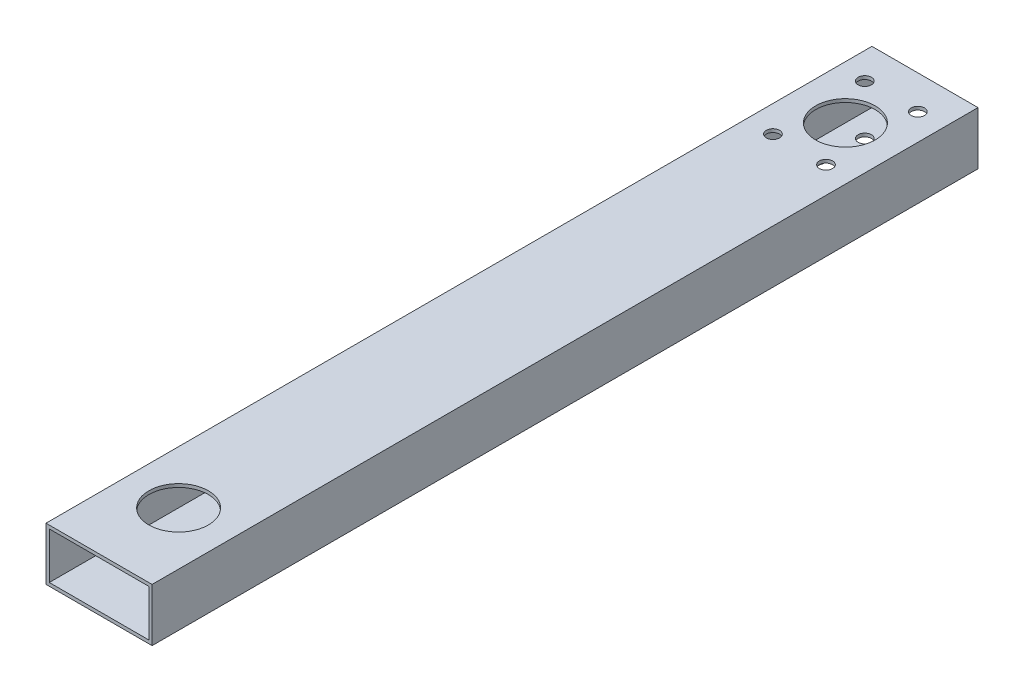
ISO-10303-21;
HEADER;
FILE_DESCRIPTION(('STEP AP214'),'2;1');
FILE_NAME('part.step','',(''),(''),'','','');
FILE_SCHEMA(('AUTOMOTIVE_DESIGN { 1 0 10303 214 1 1 1 1 }'));
ENDSEC;
DATA;
#1=APPLICATION_CONTEXT('core data for automotive mechanical design processes');
#2=APPLICATION_PROTOCOL_DEFINITION('international standard','automotive_design',2000,#1);
#3=PRODUCT_CONTEXT('',#1,'mechanical');
#4=PRODUCT('Part','Part','',(#3));
#5=PRODUCT_RELATED_PRODUCT_CATEGORY('part','',(#4));
#6=PRODUCT_DEFINITION_FORMATION('','',#4);
#7=PRODUCT_DEFINITION_CONTEXT('part definition',#1,'design');
#8=PRODUCT_DEFINITION('design','',#6,#7);
#9=PRODUCT_DEFINITION_SHAPE('','',#8);
#10=(LENGTH_UNIT() NAMED_UNIT(*) SI_UNIT(.MILLI.,.METRE.));
#11=(NAMED_UNIT(*) PLANE_ANGLE_UNIT() SI_UNIT($,.RADIAN.));
#12=(NAMED_UNIT(*) SI_UNIT($,.STERADIAN.) SOLID_ANGLE_UNIT());
#13=UNCERTAINTY_MEASURE_WITH_UNIT(LENGTH_MEASURE(1.E-05),#10,'distance_accuracy_value','');
#14=(GEOMETRIC_REPRESENTATION_CONTEXT(3) GLOBAL_UNCERTAINTY_ASSIGNED_CONTEXT((#13)) GLOBAL_UNIT_ASSIGNED_CONTEXT((#10,
#11,#12)) REPRESENTATION_CONTEXT('',''));
#15=CARTESIAN_POINT('',(0.,0.,0.));
#16=DIRECTION('',(0.,0.,1.));
#17=DIRECTION('',(1.,0.,0.));
#18=AXIS2_PLACEMENT_3D('',#15,#16,#17);
#19=CARTESIAN_POINT('',(0.,0.,395.478));
#20=DIRECTION('',(0.,0.,-1.));
#21=DIRECTION('',(-1.,0.,0.));
#22=AXIS2_PLACEMENT_3D('',#19,#20,#21);
#23=PLANE('',#22);
#24=DIRECTION('',(0.,-1.,0.));
#25=VECTOR('',#24,1.);
#26=CARTESIAN_POINT('',(0.,0.,395.478));
#27=LINE('',#26,#25);
#28=CARTESIAN_POINT('',(0.,25.4,395.478));
#29=VERTEX_POINT('',#28);
#30=CARTESIAN_POINT('',(0.,0.,395.478));
#31=VERTEX_POINT('',#30);
#32=EDGE_CURVE('E163',#29,#31,#27,.T.);
#33=ORIENTED_EDGE('',*,*,#32,.T.);
#34=DIRECTION('',(1.,0.,0.));
#35=VECTOR('',#34,1.);
#36=CARTESIAN_POINT('',(0.,0.,395.478));
#37=LINE('',#36,#35);
#38=CARTESIAN_POINT('',(50.8,0.,395.478));
#39=VERTEX_POINT('',#38);
#40=EDGE_CURVE('E167',#31,#39,#37,.T.);
#41=ORIENTED_EDGE('',*,*,#40,.T.);
#42=DIRECTION('',(0.,1.,0.));
#43=VECTOR('',#42,1.);
#44=CARTESIAN_POINT('',(50.8,0.,395.478));
#45=LINE('',#44,#43);
#46=CARTESIAN_POINT('',(50.8,25.4,395.478));
#47=VERTEX_POINT('',#46);
#48=EDGE_CURVE('E171',#39,#47,#45,.T.);
#49=ORIENTED_EDGE('',*,*,#48,.T.);
#50=DIRECTION('',(-1.,0.,0.));
#51=VECTOR('',#50,1.);
#52=CARTESIAN_POINT('',(0.,25.4,395.478));
#53=LINE('',#52,#51);
#54=EDGE_CURVE('E174',#47,#29,#53,.T.);
#55=ORIENTED_EDGE('',*,*,#54,.T.);
#56=EDGE_LOOP('',(#33,#41,#49,#55));
#57=FACE_BOUND('',#56,.T.);
#58=DIRECTION('',(0.,-1.,0.));
#59=VECTOR('',#58,1.);
#60=CARTESIAN_POINT('',(1.5875,1.5875,395.478));
#61=LINE('',#60,#59);
#62=CARTESIAN_POINT('',(1.5875,23.8125,395.478));
#63=VERTEX_POINT('',#62);
#64=CARTESIAN_POINT('',(1.5875,1.5875,395.478));
#65=VERTEX_POINT('',#64);
#66=EDGE_CURVE('E113',#63,#65,#61,.T.);
#67=ORIENTED_EDGE('',*,*,#66,.F.);
#68=DIRECTION('',(-1.,0.,0.));
#69=VECTOR('',#68,1.);
#70=CARTESIAN_POINT('',(1.5875,23.8125,395.478));
#71=LINE('',#70,#69);
#72=CARTESIAN_POINT('',(49.2125,23.8125,395.478));
#73=VERTEX_POINT('',#72);
#74=EDGE_CURVE('E139',#73,#63,#71,.T.);
#75=ORIENTED_EDGE('',*,*,#74,.F.);
#76=DIRECTION('',(0.,1.,0.));
#77=VECTOR('',#76,1.);
#78=CARTESIAN_POINT('',(49.2125,1.5875,395.478));
#79=LINE('',#78,#77);
#80=CARTESIAN_POINT('',(49.2125,1.5875,395.478));
#81=VERTEX_POINT('',#80);
#82=EDGE_CURVE('E135',#81,#73,#79,.T.);
#83=ORIENTED_EDGE('',*,*,#82,.F.);
#84=DIRECTION('',(1.,0.,0.));
#85=VECTOR('',#84,1.);
#86=CARTESIAN_POINT('',(1.5875,1.5875,395.478));
#87=LINE('',#86,#85);
#88=EDGE_CURVE('E122',#65,#81,#87,.T.);
#89=ORIENTED_EDGE('',*,*,#88,.F.);
#90=EDGE_LOOP('',(#67,#75,#83,#89));
#91=FACE_BOUND('',#90,.T.);
#92=ADVANCED_FACE('F45',(#57,#91),#23,.F.);
#93=CARTESIAN_POINT('',(0.,0.,0.));
#94=DIRECTION('',(0.,0.,-1.));
#95=DIRECTION('',(-1.,0.,0.));
#96=AXIS2_PLACEMENT_3D('',#93,#94,#95);
#97=PLANE('',#96);
#98=DIRECTION('',(0.,-1.,0.));
#99=VECTOR('',#98,1.);
#100=CARTESIAN_POINT('',(0.,0.,0.));
#101=LINE('',#100,#99);
#102=CARTESIAN_POINT('',(0.,25.4,0.));
#103=VERTEX_POINT('',#102);
#104=CARTESIAN_POINT('',(0.,0.,0.));
#105=VERTEX_POINT('',#104);
#106=EDGE_CURVE('E131',#103,#105,#101,.T.);
#107=ORIENTED_EDGE('',*,*,#106,.F.);
#108=DIRECTION('',(-1.,0.,0.));
#109=VECTOR('',#108,1.);
#110=CARTESIAN_POINT('',(0.,25.4,0.));
#111=LINE('',#110,#109);
#112=CARTESIAN_POINT('',(50.8,25.4,0.));
#113=VERTEX_POINT('',#112);
#114=EDGE_CURVE('E168',#113,#103,#111,.T.);
#115=ORIENTED_EDGE('',*,*,#114,.F.);
#116=DIRECTION('',(0.,1.,0.));
#117=VECTOR('',#116,1.);
#118=CARTESIAN_POINT('',(50.8,0.,0.));
#119=LINE('',#118,#117);
#120=CARTESIAN_POINT('',(50.8,0.,0.));
#121=VERTEX_POINT('',#120);
#122=EDGE_CURVE('E184',#121,#113,#119,.T.);
#123=ORIENTED_EDGE('',*,*,#122,.F.);
#124=DIRECTION('',(1.,0.,0.));
#125=VECTOR('',#124,1.);
#126=CARTESIAN_POINT('',(0.,0.,0.));
#127=LINE('',#126,#125);
#128=EDGE_CURVE('E181',#105,#121,#127,.T.);
#129=ORIENTED_EDGE('',*,*,#128,.F.);
#130=EDGE_LOOP('',(#107,#115,#123,#129));
#131=FACE_BOUND('',#130,.T.);
#132=DIRECTION('',(-1.,0.,0.));
#133=VECTOR('',#132,1.);
#134=CARTESIAN_POINT('',(1.5875,23.8125,0.));
#135=LINE('',#134,#133);
#136=CARTESIAN_POINT('',(49.2125,23.8125,0.));
#137=VERTEX_POINT('',#136);
#138=CARTESIAN_POINT('',(1.5875,23.8125,0.));
#139=VERTEX_POINT('',#138);
#140=EDGE_CURVE('E123',#137,#139,#135,.T.);
#141=ORIENTED_EDGE('',*,*,#140,.T.);
#142=DIRECTION('',(0.,-1.,0.));
#143=VECTOR('',#142,1.);
#144=CARTESIAN_POINT('',(1.5875,1.5875,0.));
#145=LINE('',#144,#143);
#146=CARTESIAN_POINT('',(1.5875,1.5875,0.));
#147=VERTEX_POINT('',#146);
#148=EDGE_CURVE('E71',#139,#147,#145,.T.);
#149=ORIENTED_EDGE('',*,*,#148,.T.);
#150=DIRECTION('',(1.,0.,0.));
#151=VECTOR('',#150,1.);
#152=CARTESIAN_POINT('',(1.5875,1.5875,0.));
#153=LINE('',#152,#151);
#154=CARTESIAN_POINT('',(49.2125,1.5875,0.));
#155=VERTEX_POINT('',#154);
#156=EDGE_CURVE('E129',#147,#155,#153,.T.);
#157=ORIENTED_EDGE('',*,*,#156,.T.);
#158=DIRECTION('',(0.,1.,0.));
#159=VECTOR('',#158,1.);
#160=CARTESIAN_POINT('',(49.2125,1.5875,0.));
#161=LINE('',#160,#159);
#162=EDGE_CURVE('E150',#155,#137,#161,.T.);
#163=ORIENTED_EDGE('',*,*,#162,.T.);
#164=EDGE_LOOP('',(#141,#149,#157,#163));
#165=FACE_BOUND('',#164,.T.);
#166=ADVANCED_FACE('F278',(#131,#165),#97,.T.);
#167=CARTESIAN_POINT('',(0.,0.,395.478));
#168=DIRECTION('',(1.,0.,0.));
#169=DIRECTION('',(0.,0.,-1.));
#170=AXIS2_PLACEMENT_3D('',#167,#168,#169);
#171=PLANE('',#170);
#172=ORIENTED_EDGE('',*,*,#106,.T.);
#173=DIRECTION('',(0.,0.,-1.));
#174=VECTOR('',#173,1.);
#175=CARTESIAN_POINT('',(0.,0.,395.478));
#176=LINE('',#175,#174);
#177=EDGE_CURVE('E11',#31,#105,#176,.T.);
#178=ORIENTED_EDGE('',*,*,#177,.F.);
#179=ORIENTED_EDGE('',*,*,#32,.F.);
#180=DIRECTION('',(0.,0.,-1.));
#181=VECTOR('',#180,1.);
#182=CARTESIAN_POINT('',(0.,25.4,395.478));
#183=LINE('',#182,#181);
#184=EDGE_CURVE('E177',#29,#103,#183,.T.);
#185=ORIENTED_EDGE('',*,*,#184,.T.);
#186=EDGE_LOOP('',(#172,#178,#179,#185));
#187=FACE_BOUND('',#186,.T.);
#188=ADVANCED_FACE('F47',(#187),#171,.F.);
#189=CARTESIAN_POINT('',(0.,0.,395.478));
#190=DIRECTION('',(0.,1.,0.));
#191=DIRECTION('',(0.,0.,1.));
#192=AXIS2_PLACEMENT_3D('',#189,#190,#191);
#193=PLANE('',#192);
#194=CARTESIAN_POINT('',(25.4,0.,357.378));
#195=DIRECTION('',(0.,1.,0.));
#196=DIRECTION('',(0.,0.,1.));
#197=AXIS2_PLACEMENT_3D('',#194,#195,#196);
#198=CIRCLE('',#197,14.224);
#199=CARTESIAN_POINT('',(25.4,0.,371.602));
#200=VERTEX_POINT('',#199);
#201=EDGE_CURVE('E305',#200,#200,#198,.T.);
#202=ORIENTED_EDGE('',*,*,#201,.T.);
#203=EDGE_LOOP('',(#202));
#204=FACE_BOUND('',#203,.T.);
#205=CARTESIAN_POINT('',(38.1,0.,16.1029547438753));
#206=DIRECTION('',(0.,1.,0.));
#207=DIRECTION('',(0.,0.,-1.));
#208=AXIS2_PLACEMENT_3D('',#205,#206,#207);
#209=CIRCLE('',#208,3.175);
#210=CARTESIAN_POINT('',(38.1,0.,12.9279547438753));
#211=VERTEX_POINT('',#210);
#212=EDGE_CURVE('E309',#211,#211,#209,.T.);
#213=ORIENTED_EDGE('',*,*,#212,.T.);
#214=EDGE_LOOP('',(#213));
#215=FACE_BOUND('',#214,.T.);
#216=CARTESIAN_POINT('',(38.1,0.,60.0970452561248));
#217=DIRECTION('',(0.,1.,0.));
#218=DIRECTION('',(0.,0.,-1.));
#219=AXIS2_PLACEMENT_3D('',#216,#217,#218);
#220=CIRCLE('',#219,3.175);
#221=CARTESIAN_POINT('',(38.1,0.,56.9220452561248));
#222=VERTEX_POINT('',#221);
#223=EDGE_CURVE('E313',#222,#222,#220,.T.);
#224=ORIENTED_EDGE('',*,*,#223,.T.);
#225=EDGE_LOOP('',(#224));
#226=FACE_BOUND('',#225,.T.);
#227=CARTESIAN_POINT('',(12.7,0.,60.0970452561248));
#228=DIRECTION('',(0.,1.,0.));
#229=DIRECTION('',(0.,0.,1.));
#230=AXIS2_PLACEMENT_3D('',#227,#228,#229);
#231=CIRCLE('',#230,3.175);
#232=CARTESIAN_POINT('',(12.7,0.,63.2720452561247));
#233=VERTEX_POINT('',#232);
#234=EDGE_CURVE('E317',#233,#233,#231,.T.);
#235=ORIENTED_EDGE('',*,*,#234,.T.);
#236=EDGE_LOOP('',(#235));
#237=FACE_BOUND('',#236,.T.);
#238=CARTESIAN_POINT('',(12.7,0.,16.1029547438753));
#239=DIRECTION('',(0.,1.,0.));
#240=DIRECTION('',(0.,0.,1.));
#241=AXIS2_PLACEMENT_3D('',#238,#239,#240);
#242=CIRCLE('',#241,3.175);
#243=CARTESIAN_POINT('',(12.7,0.,19.2779547438753));
#244=VERTEX_POINT('',#243);
#245=EDGE_CURVE('E321',#244,#244,#242,.T.);
#246=ORIENTED_EDGE('',*,*,#245,.T.);
#247=EDGE_LOOP('',(#246));
#248=FACE_BOUND('',#247,.T.);
#249=CARTESIAN_POINT('',(25.4,0.,38.1));
#250=DIRECTION('',(0.,1.,0.));
#251=DIRECTION('',(0.,0.,1.));
#252=AXIS2_PLACEMENT_3D('',#249,#250,#251);
#253=CIRCLE('',#252,14.224);
#254=CARTESIAN_POINT('',(25.4,0.,52.324));
#255=VERTEX_POINT('',#254);
#256=EDGE_CURVE('E204',#255,#255,#253,.T.);
#257=ORIENTED_EDGE('',*,*,#256,.T.);
#258=EDGE_LOOP('',(#257));
#259=FACE_BOUND('',#258,.T.);
#260=ORIENTED_EDGE('',*,*,#128,.T.);
#261=DIRECTION('',(0.,0.,-1.));
#262=VECTOR('',#261,1.);
#263=CARTESIAN_POINT('',(50.8,0.,395.478));
#264=LINE('',#263,#262);
#265=EDGE_CURVE('E55',#39,#121,#264,.T.);
#266=ORIENTED_EDGE('',*,*,#265,.F.);
#267=ORIENTED_EDGE('',*,*,#40,.F.);
#268=ORIENTED_EDGE('',*,*,#177,.T.);
#269=EDGE_LOOP('',(#260,#266,#267,#268));
#270=FACE_BOUND('',#269,.T.);
#271=ADVANCED_FACE('F293',(#204,#215,#226,#237,#248,#259,#270),#193,.F.);
#272=CARTESIAN_POINT('',(50.8,0.,395.478));
#273=DIRECTION('',(-1.,0.,0.));
#274=DIRECTION('',(0.,0.,1.));
#275=AXIS2_PLACEMENT_3D('',#272,#273,#274);
#276=PLANE('',#275);
#277=ORIENTED_EDGE('',*,*,#122,.T.);
#278=DIRECTION('',(0.,0.,-1.));
#279=VECTOR('',#278,1.);
#280=CARTESIAN_POINT('',(50.8,25.4,395.478));
#281=LINE('',#280,#279);
#282=EDGE_CURVE('E192',#47,#113,#281,.T.);
#283=ORIENTED_EDGE('',*,*,#282,.F.);
#284=ORIENTED_EDGE('',*,*,#48,.F.);
#285=ORIENTED_EDGE('',*,*,#265,.T.);
#286=EDGE_LOOP('',(#277,#283,#284,#285));
#287=FACE_BOUND('',#286,.T.);
#288=ADVANCED_FACE('F291',(#287),#276,.F.);
#289=CARTESIAN_POINT('',(0.,25.4,395.478));
#290=DIRECTION('',(0.,-1.,0.));
#291=DIRECTION('',(0.,0.,-1.));
#292=AXIS2_PLACEMENT_3D('',#289,#290,#291);
#293=PLANE('',#292);
#294=CARTESIAN_POINT('',(25.4,25.4,357.378));
#295=DIRECTION('',(0.,-1.,0.));
#296=DIRECTION('',(0.,0.,-1.));
#297=AXIS2_PLACEMENT_3D('',#294,#295,#296);
#298=CIRCLE('',#297,14.224);
#299=CARTESIAN_POINT('',(25.4,25.4,343.154));
#300=VERTEX_POINT('',#299);
#301=EDGE_CURVE('E147',#300,#300,#298,.T.);
#302=ORIENTED_EDGE('',*,*,#301,.T.);
#303=EDGE_LOOP('',(#302));
#304=FACE_BOUND('',#303,.T.);
#305=CARTESIAN_POINT('',(38.1,25.4,16.1029547438753));
#306=DIRECTION('',(0.,-1.,0.));
#307=DIRECTION('',(0.,0.,-1.));
#308=AXIS2_PLACEMENT_3D('',#305,#306,#307);
#309=CIRCLE('',#308,3.175);
#310=CARTESIAN_POINT('',(38.1,25.4,12.9279547438753));
#311=VERTEX_POINT('',#310);
#312=EDGE_CURVE('E232',#311,#311,#309,.T.);
#313=ORIENTED_EDGE('',*,*,#312,.T.);
#314=EDGE_LOOP('',(#313));
#315=FACE_BOUND('',#314,.T.);
#316=CARTESIAN_POINT('',(38.1,25.4,60.0970452561248));
#317=DIRECTION('',(0.,-1.,0.));
#318=DIRECTION('',(0.,0.,-1.));
#319=AXIS2_PLACEMENT_3D('',#316,#317,#318);
#320=CIRCLE('',#319,3.175);
#321=CARTESIAN_POINT('',(38.1,25.4,56.9220452561248));
#322=VERTEX_POINT('',#321);
#323=EDGE_CURVE('E226',#322,#322,#320,.T.);
#324=ORIENTED_EDGE('',*,*,#323,.T.);
#325=EDGE_LOOP('',(#324));
#326=FACE_BOUND('',#325,.T.);
#327=CARTESIAN_POINT('',(12.7,25.4,60.0970452561248));
#328=DIRECTION('',(0.,-1.,0.));
#329=DIRECTION('',(0.,0.,-1.));
#330=AXIS2_PLACEMENT_3D('',#327,#328,#329);
#331=CIRCLE('',#330,3.175);
#332=CARTESIAN_POINT('',(12.7,25.4,56.9220452561248));
#333=VERTEX_POINT('',#332);
#334=EDGE_CURVE('E221',#333,#333,#331,.T.);
#335=ORIENTED_EDGE('',*,*,#334,.T.);
#336=EDGE_LOOP('',(#335));
#337=FACE_BOUND('',#336,.T.);
#338=CARTESIAN_POINT('',(12.7,25.4,16.1029547438753));
#339=DIRECTION('',(0.,-1.,0.));
#340=DIRECTION('',(0.,0.,-1.));
#341=AXIS2_PLACEMENT_3D('',#338,#339,#340);
#342=CIRCLE('',#341,3.175);
#343=CARTESIAN_POINT('',(12.7,25.4,12.9279547438753));
#344=VERTEX_POINT('',#343);
#345=EDGE_CURVE('E216',#344,#344,#342,.T.);
#346=ORIENTED_EDGE('',*,*,#345,.T.);
#347=EDGE_LOOP('',(#346));
#348=FACE_BOUND('',#347,.T.);
#349=CARTESIAN_POINT('',(25.4,25.4,38.1));
#350=DIRECTION('',(0.,-1.,0.));
#351=DIRECTION('',(0.,0.,-1.));
#352=AXIS2_PLACEMENT_3D('',#349,#350,#351);
#353=CIRCLE('',#352,14.224);
#354=CARTESIAN_POINT('',(25.4,25.4,23.876));
#355=VERTEX_POINT('',#354);
#356=EDGE_CURVE('E210',#355,#355,#353,.T.);
#357=ORIENTED_EDGE('',*,*,#356,.T.);
#358=EDGE_LOOP('',(#357));
#359=FACE_BOUND('',#358,.T.);
#360=ORIENTED_EDGE('',*,*,#114,.T.);
#361=ORIENTED_EDGE('',*,*,#184,.F.);
#362=ORIENTED_EDGE('',*,*,#54,.F.);
#363=ORIENTED_EDGE('',*,*,#282,.T.);
#364=EDGE_LOOP('',(#360,#361,#362,#363));
#365=FACE_BOUND('',#364,.T.);
#366=ADVANCED_FACE('F253',(#304,#315,#326,#337,#348,#359,#365),#293,.F.);
#367=CARTESIAN_POINT('',(1.5875,1.5875,395.478));
#368=DIRECTION('',(1.,0.,0.));
#369=DIRECTION('',(0.,0.,-1.));
#370=AXIS2_PLACEMENT_3D('',#367,#368,#369);
#371=PLANE('',#370);
#372=ORIENTED_EDGE('',*,*,#148,.F.);
#373=DIRECTION('',(0.,0.,-1.));
#374=VECTOR('',#373,1.);
#375=CARTESIAN_POINT('',(1.5875,23.8125,395.478));
#376=LINE('',#375,#374);
#377=EDGE_CURVE('E117',#63,#139,#376,.T.);
#378=ORIENTED_EDGE('',*,*,#377,.F.);
#379=ORIENTED_EDGE('',*,*,#66,.T.);
#380=DIRECTION('',(0.,0.,-1.));
#381=VECTOR('',#380,1.);
#382=CARTESIAN_POINT('',(1.5875,1.5875,395.478));
#383=LINE('',#382,#381);
#384=EDGE_CURVE('E116',#65,#147,#383,.T.);
#385=ORIENTED_EDGE('',*,*,#384,.T.);
#386=EDGE_LOOP('',(#372,#378,#379,#385));
#387=FACE_BOUND('',#386,.T.);
#388=ADVANCED_FACE('F115',(#387),#371,.T.);
#389=CARTESIAN_POINT('',(1.5875,1.5875,395.478));
#390=DIRECTION('',(0.,1.,0.));
#391=DIRECTION('',(0.,0.,1.));
#392=AXIS2_PLACEMENT_3D('',#389,#390,#391);
#393=PLANE('',#392);
#394=CARTESIAN_POINT('',(25.4,1.5875,357.378));
#395=DIRECTION('',(0.,1.,0.));
#396=DIRECTION('',(0.,0.,1.));
#397=AXIS2_PLACEMENT_3D('',#394,#395,#396);
#398=CIRCLE('',#397,14.224);
#399=CARTESIAN_POINT('',(25.4,1.5875,371.602));
#400=VERTEX_POINT('',#399);
#401=EDGE_CURVE('E246',#400,#400,#398,.T.);
#402=ORIENTED_EDGE('',*,*,#401,.F.);
#403=EDGE_LOOP('',(#402));
#404=FACE_BOUND('',#403,.T.);
#405=CARTESIAN_POINT('',(38.1,1.5875,16.1029547438753));
#406=DIRECTION('',(0.,1.,0.));
#407=DIRECTION('',(0.,0.,1.));
#408=AXIS2_PLACEMENT_3D('',#405,#406,#407);
#409=CIRCLE('',#408,3.175);
#410=CARTESIAN_POINT('',(38.1,1.5875,19.2779547438753));
#411=VERTEX_POINT('',#410);
#412=EDGE_CURVE('E225',#411,#411,#409,.T.);
#413=ORIENTED_EDGE('',*,*,#412,.F.);
#414=EDGE_LOOP('',(#413));
#415=FACE_BOUND('',#414,.T.);
#416=CARTESIAN_POINT('',(38.1,1.5875,60.0970452561248));
#417=DIRECTION('',(0.,1.,0.));
#418=DIRECTION('',(0.,0.,1.));
#419=AXIS2_PLACEMENT_3D('',#416,#417,#418);
#420=CIRCLE('',#419,3.175);
#421=CARTESIAN_POINT('',(38.1,1.5875,63.2720452561247));
#422=VERTEX_POINT('',#421);
#423=EDGE_CURVE('E220',#422,#422,#420,.T.);
#424=ORIENTED_EDGE('',*,*,#423,.F.);
#425=EDGE_LOOP('',(#424));
#426=FACE_BOUND('',#425,.T.);
#427=CARTESIAN_POINT('',(12.7,1.5875,60.0970452561248));
#428=DIRECTION('',(0.,1.,0.));
#429=DIRECTION('',(0.,0.,1.));
#430=AXIS2_PLACEMENT_3D('',#427,#428,#429);
#431=CIRCLE('',#430,3.175);
#432=CARTESIAN_POINT('',(12.7,1.5875,63.2720452561247));
#433=VERTEX_POINT('',#432);
#434=EDGE_CURVE('E215',#433,#433,#431,.T.);
#435=ORIENTED_EDGE('',*,*,#434,.F.);
#436=EDGE_LOOP('',(#435));
#437=FACE_BOUND('',#436,.T.);
#438=CARTESIAN_POINT('',(12.7,1.5875,16.1029547438753));
#439=DIRECTION('',(0.,1.,0.));
#440=DIRECTION('',(0.,0.,1.));
#441=AXIS2_PLACEMENT_3D('',#438,#439,#440);
#442=CIRCLE('',#441,3.175);
#443=CARTESIAN_POINT('',(12.7,1.5875,19.2779547438753));
#444=VERTEX_POINT('',#443);
#445=EDGE_CURVE('E209',#444,#444,#442,.T.);
#446=ORIENTED_EDGE('',*,*,#445,.F.);
#447=EDGE_LOOP('',(#446));
#448=FACE_BOUND('',#447,.T.);
#449=CARTESIAN_POINT('',(25.4,1.5875,38.1));
#450=DIRECTION('',(0.,1.,0.));
#451=DIRECTION('',(0.,0.,1.));
#452=AXIS2_PLACEMENT_3D('',#449,#450,#451);
#453=CIRCLE('',#452,14.224);
#454=CARTESIAN_POINT('',(25.4,1.5875,52.324));
#455=VERTEX_POINT('',#454);
#456=EDGE_CURVE('E203',#455,#455,#453,.T.);
#457=ORIENTED_EDGE('',*,*,#456,.F.);
#458=EDGE_LOOP('',(#457));
#459=FACE_BOUND('',#458,.T.);
#460=ORIENTED_EDGE('',*,*,#156,.F.);
#461=ORIENTED_EDGE('',*,*,#384,.F.);
#462=ORIENTED_EDGE('',*,*,#88,.T.);
#463=DIRECTION('',(0.,0.,-1.));
#464=VECTOR('',#463,1.);
#465=CARTESIAN_POINT('',(49.2125,1.5875,395.478));
#466=LINE('',#465,#464);
#467=EDGE_CURVE('E132',#81,#155,#466,.T.);
#468=ORIENTED_EDGE('',*,*,#467,.T.);
#469=EDGE_LOOP('',(#460,#461,#462,#468));
#470=FACE_BOUND('',#469,.T.);
#471=ADVANCED_FACE('F126',(#404,#415,#426,#437,#448,#459,#470),#393,.T.);
#472=CARTESIAN_POINT('',(49.2125,1.5875,395.478));
#473=DIRECTION('',(-1.,0.,0.));
#474=DIRECTION('',(0.,0.,1.));
#475=AXIS2_PLACEMENT_3D('',#472,#473,#474);
#476=PLANE('',#475);
#477=ORIENTED_EDGE('',*,*,#162,.F.);
#478=ORIENTED_EDGE('',*,*,#467,.F.);
#479=ORIENTED_EDGE('',*,*,#82,.T.);
#480=DIRECTION('',(0.,0.,-1.));
#481=VECTOR('',#480,1.);
#482=CARTESIAN_POINT('',(49.2125,23.8125,395.478));
#483=LINE('',#482,#481);
#484=EDGE_CURVE('E63',#73,#137,#483,.T.);
#485=ORIENTED_EDGE('',*,*,#484,.T.);
#486=EDGE_LOOP('',(#477,#478,#479,#485));
#487=FACE_BOUND('',#486,.T.);
#488=ADVANCED_FACE('F340',(#487),#476,.T.);
#489=CARTESIAN_POINT('',(1.5875,23.8125,395.478));
#490=DIRECTION('',(0.,-1.,0.));
#491=DIRECTION('',(0.,0.,-1.));
#492=AXIS2_PLACEMENT_3D('',#489,#490,#491);
#493=PLANE('',#492);
#494=CARTESIAN_POINT('',(25.4,23.8125,357.378));
#495=DIRECTION('',(0.,-1.,0.));
#496=DIRECTION('',(0.,0.,-1.));
#497=AXIS2_PLACEMENT_3D('',#494,#495,#496);
#498=CIRCLE('',#497,14.224);
#499=CARTESIAN_POINT('',(25.4,23.8125,343.154));
#500=VERTEX_POINT('',#499);
#501=EDGE_CURVE('E49',#500,#500,#498,.T.);
#502=ORIENTED_EDGE('',*,*,#501,.F.);
#503=EDGE_LOOP('',(#502));
#504=FACE_BOUND('',#503,.T.);
#505=CARTESIAN_POINT('',(38.1,23.8125,16.1029547438753));
#506=DIRECTION('',(0.,-1.,0.));
#507=DIRECTION('',(0.,0.,-1.));
#508=AXIS2_PLACEMENT_3D('',#505,#506,#507);
#509=CIRCLE('',#508,3.175);
#510=CARTESIAN_POINT('',(38.1,23.8125,12.9279547438753));
#511=VERTEX_POINT('',#510);
#512=EDGE_CURVE('E222',#511,#511,#509,.T.);
#513=ORIENTED_EDGE('',*,*,#512,.F.);
#514=EDGE_LOOP('',(#513));
#515=FACE_BOUND('',#514,.T.);
#516=CARTESIAN_POINT('',(38.1,23.8125,60.0970452561248));
#517=DIRECTION('',(0.,-1.,0.));
#518=DIRECTION('',(0.,0.,-1.));
#519=AXIS2_PLACEMENT_3D('',#516,#517,#518);
#520=CIRCLE('',#519,3.175);
#521=CARTESIAN_POINT('',(38.1,23.8125,56.9220452561248));
#522=VERTEX_POINT('',#521);
#523=EDGE_CURVE('E217',#522,#522,#520,.T.);
#524=ORIENTED_EDGE('',*,*,#523,.F.);
#525=EDGE_LOOP('',(#524));
#526=FACE_BOUND('',#525,.T.);
#527=CARTESIAN_POINT('',(12.7,23.8125,60.0970452561248));
#528=DIRECTION('',(0.,-1.,0.));
#529=DIRECTION('',(0.,0.,-1.));
#530=AXIS2_PLACEMENT_3D('',#527,#528,#529);
#531=CIRCLE('',#530,3.175);
#532=CARTESIAN_POINT('',(12.7,23.8125,56.9220452561248));
#533=VERTEX_POINT('',#532);
#534=EDGE_CURVE('E211',#533,#533,#531,.T.);
#535=ORIENTED_EDGE('',*,*,#534,.F.);
#536=EDGE_LOOP('',(#535));
#537=FACE_BOUND('',#536,.T.);
#538=CARTESIAN_POINT('',(12.7,23.8125,16.1029547438753));
#539=DIRECTION('',(0.,-1.,0.));
#540=DIRECTION('',(0.,0.,-1.));
#541=AXIS2_PLACEMENT_3D('',#538,#539,#540);
#542=CIRCLE('',#541,3.175);
#543=CARTESIAN_POINT('',(12.7,23.8125,12.9279547438753));
#544=VERTEX_POINT('',#543);
#545=EDGE_CURVE('E205',#544,#544,#542,.T.);
#546=ORIENTED_EDGE('',*,*,#545,.F.);
#547=EDGE_LOOP('',(#546));
#548=FACE_BOUND('',#547,.T.);
#549=CARTESIAN_POINT('',(25.4,23.8125,38.1));
#550=DIRECTION('',(0.,-1.,0.));
#551=DIRECTION('',(0.,0.,-1.));
#552=AXIS2_PLACEMENT_3D('',#549,#550,#551);
#553=CIRCLE('',#552,14.224);
#554=CARTESIAN_POINT('',(25.4,23.8125,23.876));
#555=VERTEX_POINT('',#554);
#556=EDGE_CURVE('E199',#555,#555,#553,.T.);
#557=ORIENTED_EDGE('',*,*,#556,.F.);
#558=EDGE_LOOP('',(#557));
#559=FACE_BOUND('',#558,.T.);
#560=ORIENTED_EDGE('',*,*,#140,.F.);
#561=ORIENTED_EDGE('',*,*,#484,.F.);
#562=ORIENTED_EDGE('',*,*,#74,.T.);
#563=ORIENTED_EDGE('',*,*,#377,.T.);
#564=EDGE_LOOP('',(#560,#561,#562,#563));
#565=FACE_BOUND('',#564,.T.);
#566=ADVANCED_FACE('F338',(#504,#515,#526,#537,#548,#559,#565),#493,.T.);
#567=CARTESIAN_POINT('',(25.4,0.,38.1));
#568=DIRECTION('',(0.,1.,0.));
#569=DIRECTION('',(0.,0.,1.));
#570=AXIS2_PLACEMENT_3D('',#567,#568,#569);
#571=CYLINDRICAL_SURFACE('',#570,14.224);
#572=ORIENTED_EDGE('',*,*,#556,.T.);
#573=EDGE_LOOP('',(#572));
#574=FACE_BOUND('',#573,.T.);
#575=ORIENTED_EDGE('',*,*,#356,.F.);
#576=EDGE_LOOP('',(#575));
#577=FACE_BOUND('',#576,.T.);
#578=ADVANCED_FACE('F270',(#574,#577),#571,.F.);
#579=CARTESIAN_POINT('',(12.7,0.,16.1029547438753));
#580=DIRECTION('',(0.,1.,0.));
#581=DIRECTION('',(0.,0.,1.));
#582=AXIS2_PLACEMENT_3D('',#579,#580,#581);
#583=CYLINDRICAL_SURFACE('',#582,3.175);
#584=ORIENTED_EDGE('',*,*,#545,.T.);
#585=EDGE_LOOP('',(#584));
#586=FACE_BOUND('',#585,.T.);
#587=ORIENTED_EDGE('',*,*,#345,.F.);
#588=EDGE_LOOP('',(#587));
#589=FACE_BOUND('',#588,.T.);
#590=ADVANCED_FACE('F347',(#586,#589),#583,.F.);
#591=CARTESIAN_POINT('',(12.7,0.,60.0970452561248));
#592=DIRECTION('',(0.,1.,0.));
#593=DIRECTION('',(0.,0.,1.));
#594=AXIS2_PLACEMENT_3D('',#591,#592,#593);
#595=CYLINDRICAL_SURFACE('',#594,3.175);
#596=ORIENTED_EDGE('',*,*,#534,.T.);
#597=EDGE_LOOP('',(#596));
#598=FACE_BOUND('',#597,.T.);
#599=ORIENTED_EDGE('',*,*,#334,.F.);
#600=EDGE_LOOP('',(#599));
#601=FACE_BOUND('',#600,.T.);
#602=ADVANCED_FACE('F391',(#598,#601),#595,.F.);
#603=CARTESIAN_POINT('',(38.1,0.,60.0970452561248));
#604=DIRECTION('',(0.,1.,0.));
#605=DIRECTION('',(0.,0.,1.));
#606=AXIS2_PLACEMENT_3D('',#603,#604,#605);
#607=CYLINDRICAL_SURFACE('',#606,3.175);
#608=ORIENTED_EDGE('',*,*,#523,.T.);
#609=EDGE_LOOP('',(#608));
#610=FACE_BOUND('',#609,.T.);
#611=ORIENTED_EDGE('',*,*,#323,.F.);
#612=EDGE_LOOP('',(#611));
#613=FACE_BOUND('',#612,.T.);
#614=ADVANCED_FACE('F271',(#610,#613),#607,.F.);
#615=CARTESIAN_POINT('',(38.1,0.,16.1029547438753));
#616=DIRECTION('',(0.,1.,0.));
#617=DIRECTION('',(0.,0.,1.));
#618=AXIS2_PLACEMENT_3D('',#615,#616,#617);
#619=CYLINDRICAL_SURFACE('',#618,3.175);
#620=ORIENTED_EDGE('',*,*,#512,.T.);
#621=EDGE_LOOP('',(#620));
#622=FACE_BOUND('',#621,.T.);
#623=ORIENTED_EDGE('',*,*,#312,.F.);
#624=EDGE_LOOP('',(#623));
#625=FACE_BOUND('',#624,.T.);
#626=ADVANCED_FACE('F259',(#622,#625),#619,.F.);
#627=CARTESIAN_POINT('',(25.4,0.,357.378));
#628=DIRECTION('',(0.,1.,0.));
#629=DIRECTION('',(0.,0.,1.));
#630=AXIS2_PLACEMENT_3D('',#627,#628,#629);
#631=CYLINDRICAL_SURFACE('',#630,14.224);
#632=ORIENTED_EDGE('',*,*,#501,.T.);
#633=EDGE_LOOP('',(#632));
#634=FACE_BOUND('',#633,.T.);
#635=ORIENTED_EDGE('',*,*,#301,.F.);
#636=EDGE_LOOP('',(#635));
#637=FACE_BOUND('',#636,.T.);
#638=ADVANCED_FACE('F256',(#634,#637),#631,.F.);
#639=ORIENTED_EDGE('',*,*,#456,.T.);
#640=EDGE_LOOP('',(#639));
#641=FACE_BOUND('',#640,.T.);
#642=ORIENTED_EDGE('',*,*,#256,.F.);
#643=EDGE_LOOP('',(#642));
#644=FACE_BOUND('',#643,.T.);
#645=ADVANCED_FACE('F258',(#641,#644),#571,.F.);
#646=ORIENTED_EDGE('',*,*,#445,.T.);
#647=EDGE_LOOP('',(#646));
#648=FACE_BOUND('',#647,.T.);
#649=ORIENTED_EDGE('',*,*,#245,.F.);
#650=EDGE_LOOP('',(#649));
#651=FACE_BOUND('',#650,.T.);
#652=ADVANCED_FACE('F267',(#648,#651),#583,.F.);
#653=ORIENTED_EDGE('',*,*,#434,.T.);
#654=EDGE_LOOP('',(#653));
#655=FACE_BOUND('',#654,.T.);
#656=ORIENTED_EDGE('',*,*,#234,.F.);
#657=EDGE_LOOP('',(#656));
#658=FACE_BOUND('',#657,.T.);
#659=ADVANCED_FACE('F395',(#655,#658),#595,.F.);
#660=ORIENTED_EDGE('',*,*,#423,.T.);
#661=EDGE_LOOP('',(#660));
#662=FACE_BOUND('',#661,.T.);
#663=ORIENTED_EDGE('',*,*,#223,.F.);
#664=EDGE_LOOP('',(#663));
#665=FACE_BOUND('',#664,.T.);
#666=ADVANCED_FACE('F402',(#662,#665),#607,.F.);
#667=ORIENTED_EDGE('',*,*,#412,.T.);
#668=EDGE_LOOP('',(#667));
#669=FACE_BOUND('',#668,.T.);
#670=ORIENTED_EDGE('',*,*,#212,.F.);
#671=EDGE_LOOP('',(#670));
#672=FACE_BOUND('',#671,.T.);
#673=ADVANCED_FACE('F273',(#669,#672),#619,.F.);
#674=ORIENTED_EDGE('',*,*,#401,.T.);
#675=EDGE_LOOP('',(#674));
#676=FACE_BOUND('',#675,.T.);
#677=ORIENTED_EDGE('',*,*,#201,.F.);
#678=EDGE_LOOP('',(#677));
#679=FACE_BOUND('',#678,.T.);
#680=ADVANCED_FACE('F262',(#676,#679),#631,.F.);
#681=CLOSED_SHELL('',(#92,#166,#188,#271,#288,#366,#388,#471,#488,#566,#578,#590,#602,#614,#626,
#638,#645,#652,#659,#666,#673,#680));
#682=MANIFOLD_SOLID_BREP('B2',#681);
#683=ADVANCED_BREP_SHAPE_REPRESENTATION('',(#18,#682),#14);
#684=SHAPE_DEFINITION_REPRESENTATION(#9,#683);
ENDSEC;
END-ISO-10303-21;
